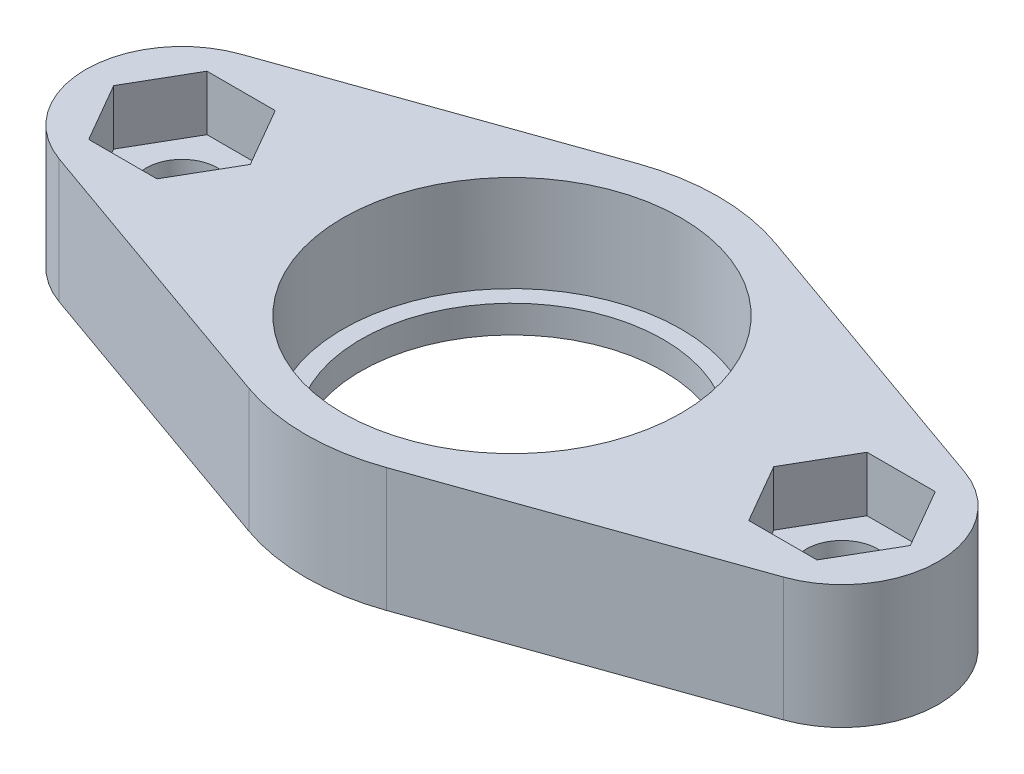
ISO-10303-21;
HEADER;
FILE_DESCRIPTION(('STEP AP214'),'2;1');
FILE_NAME('part.step','',(''),(''),'','','');
FILE_SCHEMA(('AUTOMOTIVE_DESIGN { 1 0 10303 214 1 1 1 1 }'));
ENDSEC;
DATA;
#1=APPLICATION_CONTEXT('core data for automotive mechanical design processes');
#2=APPLICATION_PROTOCOL_DEFINITION('international standard','automotive_design',2000,#1);
#3=PRODUCT_CONTEXT('',#1,'mechanical');
#4=PRODUCT('Part','Part','',(#3));
#5=PRODUCT_RELATED_PRODUCT_CATEGORY('part','',(#4));
#6=PRODUCT_DEFINITION_FORMATION('','',#4);
#7=PRODUCT_DEFINITION_CONTEXT('part definition',#1,'design');
#8=PRODUCT_DEFINITION('design','',#6,#7);
#9=PRODUCT_DEFINITION_SHAPE('','',#8);
#10=(LENGTH_UNIT() NAMED_UNIT(*) SI_UNIT(.MILLI.,.METRE.));
#11=(NAMED_UNIT(*) PLANE_ANGLE_UNIT() SI_UNIT($,.RADIAN.));
#12=(NAMED_UNIT(*) SI_UNIT($,.STERADIAN.) SOLID_ANGLE_UNIT());
#13=UNCERTAINTY_MEASURE_WITH_UNIT(LENGTH_MEASURE(1.E-05),#10,'distance_accuracy_value','');
#14=(GEOMETRIC_REPRESENTATION_CONTEXT(3) GLOBAL_UNCERTAINTY_ASSIGNED_CONTEXT((#13)) GLOBAL_UNIT_ASSIGNED_CONTEXT((#10,
#11,#12)) REPRESENTATION_CONTEXT('',''));
#15=CARTESIAN_POINT('',(0.,0.,0.));
#16=DIRECTION('',(0.,0.,1.));
#17=DIRECTION('',(1.,0.,0.));
#18=AXIS2_PLACEMENT_3D('',#15,#16,#17);
#19=CARTESIAN_POINT('',(-12.,4.5,0.));
#20=DIRECTION('',(0.,1.,0.));
#21=DIRECTION('',(0.,0.,1.));
#22=AXIS2_PLACEMENT_3D('',#19,#20,#21);
#23=CYLINDRICAL_SURFACE('',#22,1.29999999999999);
#24=CARTESIAN_POINT('',(-12.,0.,0.));
#25=DIRECTION('',(0.,1.,0.));
#26=DIRECTION('',(0.,0.,1.));
#27=AXIS2_PLACEMENT_3D('',#24,#25,#26);
#28=CIRCLE('',#27,1.3);
#29=CARTESIAN_POINT('',(-12.,0.,1.3));
#30=VERTEX_POINT('',#29);
#31=EDGE_CURVE('E282',#30,#30,#28,.T.);
#32=ORIENTED_EDGE('',*,*,#31,.F.);
#33=EDGE_LOOP('',(#32));
#34=FACE_BOUND('',#33,.T.);
#35=CARTESIAN_POINT('',(-12.,2.5,0.));
#36=DIRECTION('',(0.,1.,0.));
#37=DIRECTION('',(0.,0.,1.));
#38=AXIS2_PLACEMENT_3D('',#35,#36,#37);
#39=CIRCLE('',#38,1.29999999999999);
#40=CARTESIAN_POINT('',(-12.,2.5,1.29999999999999));
#41=VERTEX_POINT('',#40);
#42=EDGE_CURVE('E263',#41,#41,#39,.F.);
#43=ORIENTED_EDGE('',*,*,#42,.F.);
#44=EDGE_LOOP('',(#43));
#45=FACE_BOUND('',#44,.T.);
#46=ADVANCED_FACE('F32',(#34,#45),#23,.F.);
#47=CARTESIAN_POINT('',(0.,4.5,0.));
#48=DIRECTION('',(0.,-1.,0.));
#49=DIRECTION('',(0.,0.,-1.));
#50=AXIS2_PLACEMENT_3D('',#47,#48,#49);
#51=CYLINDRICAL_SURFACE('',#50,6.15);
#52=CARTESIAN_POINT('',(0.,4.5,0.));
#53=DIRECTION('',(0.,1.,0.));
#54=DIRECTION('',(0.,0.,1.));
#55=AXIS2_PLACEMENT_3D('',#52,#53,#54);
#56=CIRCLE('',#55,6.15);
#57=CARTESIAN_POINT('',(0.,4.5,6.15));
#58=VERTEX_POINT('',#57);
#59=EDGE_CURVE('E328',#58,#58,#56,.T.);
#60=ORIENTED_EDGE('',*,*,#59,.T.);
#61=EDGE_LOOP('',(#60));
#62=FACE_BOUND('',#61,.T.);
#63=CARTESIAN_POINT('',(0.,1.,0.));
#64=DIRECTION('',(0.,-1.,0.));
#65=DIRECTION('',(0.,0.,-1.));
#66=AXIS2_PLACEMENT_3D('',#63,#64,#65);
#67=CIRCLE('',#66,6.15);
#68=CARTESIAN_POINT('',(0.,1.,-6.15));
#69=VERTEX_POINT('',#68);
#70=EDGE_CURVE('E276',#69,#69,#67,.T.);
#71=ORIENTED_EDGE('',*,*,#70,.T.);
#72=EDGE_LOOP('',(#71));
#73=FACE_BOUND('',#72,.T.);
#74=ADVANCED_FACE('F351',(#62,#73),#51,.F.);
#75=CARTESIAN_POINT('',(0.,4.5,0.));
#76=DIRECTION('',(0.,-1.,0.));
#77=DIRECTION('',(0.,0.,-1.));
#78=AXIS2_PLACEMENT_3D('',#75,#76,#77);
#79=CYLINDRICAL_SURFACE('',#78,7.5);
#80=DIRECTION('',(0.,-1.,0.));
#81=VECTOR('',#80,1.);
#82=CARTESIAN_POINT('',(2.5,23.7093727122985,7.07106781186547));
#83=LINE('',#82,#81);
#84=CARTESIAN_POINT('',(2.5,4.5,7.07106781186547));
#85=VERTEX_POINT('',#84);
#86=CARTESIAN_POINT('',(2.5,0.,7.07106781186547));
#87=VERTEX_POINT('',#86);
#88=EDGE_CURVE('E293',#85,#87,#83,.T.);
#89=ORIENTED_EDGE('',*,*,#88,.F.);
#90=CARTESIAN_POINT('',(0.,4.5,0.));
#91=DIRECTION('',(0.,1.,0.));
#92=DIRECTION('',(0.,0.,1.));
#93=AXIS2_PLACEMENT_3D('',#90,#91,#92);
#94=CIRCLE('',#93,7.5);
#95=CARTESIAN_POINT('',(-2.5,4.5,7.07106781186548));
#96=VERTEX_POINT('',#95);
#97=EDGE_CURVE('E11',#96,#85,#94,.T.);
#98=ORIENTED_EDGE('',*,*,#97,.F.);
#99=DIRECTION('',(0.,-1.,0.));
#100=VECTOR('',#99,1.);
#101=CARTESIAN_POINT('',(-2.5,23.7093727122985,7.07106781186547));
#102=LINE('',#101,#100);
#103=CARTESIAN_POINT('',(-2.5,0.,7.07106781186547));
#104=VERTEX_POINT('',#103);
#105=EDGE_CURVE('E321',#96,#104,#102,.T.);
#106=ORIENTED_EDGE('',*,*,#105,.T.);
#107=CARTESIAN_POINT('',(0.,0.,0.));
#108=DIRECTION('',(0.,1.,0.));
#109=DIRECTION('',(0.,0.,1.));
#110=AXIS2_PLACEMENT_3D('',#107,#108,#109);
#111=CIRCLE('',#110,7.5);
#112=EDGE_CURVE('E343',#104,#87,#111,.T.);
#113=ORIENTED_EDGE('',*,*,#112,.T.);
#114=EDGE_LOOP('',(#89,#98,#106,#113));
#115=FACE_BOUND('',#114,.T.);
#116=ADVANCED_FACE('F357',(#115),#79,.T.);
#117=CARTESIAN_POINT('',(0.,4.5,0.));
#118=DIRECTION('',(0.,1.,0.));
#119=DIRECTION('',(0.,0.,1.));
#120=AXIS2_PLACEMENT_3D('',#117,#118,#119);
#121=PLANE('',#120);
#122=DIRECTION('',(-0.5,0.,0.866025403784438));
#123=VECTOR('',#122,1.);
#124=CARTESIAN_POINT('',(9.51739384248461,4.5,0.));
#125=LINE('',#124,#123);
#126=CARTESIAN_POINT('',(10.7586969212423,4.5,-2.15));
#127=VERTEX_POINT('',#126);
#128=CARTESIAN_POINT('',(9.51739384248461,4.5,0.));
#129=VERTEX_POINT('',#128);
#130=EDGE_CURVE('E49',#127,#129,#125,.T.);
#131=ORIENTED_EDGE('',*,*,#130,.F.);
#132=DIRECTION('',(-1.,0.,0.));
#133=VECTOR('',#132,1.);
#134=CARTESIAN_POINT('',(10.7586969212423,4.5,-2.15));
#135=LINE('',#134,#133);
#136=CARTESIAN_POINT('',(13.2413030787577,4.5,-2.15));
#137=VERTEX_POINT('',#136);
#138=EDGE_CURVE('E193',#137,#127,#135,.T.);
#139=ORIENTED_EDGE('',*,*,#138,.F.);
#140=DIRECTION('',(-0.5,0.,-0.866025403784439));
#141=VECTOR('',#140,1.);
#142=CARTESIAN_POINT('',(13.2413030787577,4.5,-2.15));
#143=LINE('',#142,#141);
#144=CARTESIAN_POINT('',(14.4826061575154,4.5,0.));
#145=VERTEX_POINT('',#144);
#146=EDGE_CURVE('E196',#145,#137,#143,.T.);
#147=ORIENTED_EDGE('',*,*,#146,.F.);
#148=DIRECTION('',(0.499999999999999,0.,-0.866025403784439));
#149=VECTOR('',#148,1.);
#150=CARTESIAN_POINT('',(14.4826061575154,4.5,0.));
#151=LINE('',#150,#149);
#152=CARTESIAN_POINT('',(13.2413030787577,4.5,2.15));
#153=VERTEX_POINT('',#152);
#154=EDGE_CURVE('E212',#153,#145,#151,.T.);
#155=ORIENTED_EDGE('',*,*,#154,.F.);
#156=DIRECTION('',(1.,0.,0.));
#157=VECTOR('',#156,1.);
#158=CARTESIAN_POINT('',(13.2413030787577,4.5,2.15));
#159=LINE('',#158,#157);
#160=CARTESIAN_POINT('',(10.7586969212423,4.5,2.15));
#161=VERTEX_POINT('',#160);
#162=EDGE_CURVE('E209',#161,#153,#159,.T.);
#163=ORIENTED_EDGE('',*,*,#162,.F.);
#164=DIRECTION('',(0.500000000000001,0.,0.866025403784438));
#165=VECTOR('',#164,1.);
#166=CARTESIAN_POINT('',(10.7586969212423,4.5,2.15));
#167=LINE('',#166,#165);
#168=EDGE_CURVE('E207',#129,#161,#167,.T.);
#169=ORIENTED_EDGE('',*,*,#168,.F.);
#170=EDGE_LOOP('',(#131,#139,#147,#155,#163,#169));
#171=FACE_BOUND('',#170,.T.);
#172=DIRECTION('',(-1.,0.,0.));
#173=VECTOR('',#172,1.);
#174=CARTESIAN_POINT('',(-10.7586969212423,4.5,-2.15));
#175=LINE('',#174,#173);
#176=CARTESIAN_POINT('',(-10.7586969212423,4.5,-2.15));
#177=VERTEX_POINT('',#176);
#178=CARTESIAN_POINT('',(-13.2413030787577,4.5,-2.15));
#179=VERTEX_POINT('',#178);
#180=EDGE_CURVE('E57',#177,#179,#175,.T.);
#181=ORIENTED_EDGE('',*,*,#180,.F.);
#182=DIRECTION('',(-0.5,0.,-0.866025403784439));
#183=VECTOR('',#182,1.);
#184=CARTESIAN_POINT('',(-9.51739384248461,4.5,0.));
#185=LINE('',#184,#183);
#186=CARTESIAN_POINT('',(-9.51739384248461,4.5,0.));
#187=VERTEX_POINT('',#186);
#188=EDGE_CURVE('E230',#187,#177,#185,.T.);
#189=ORIENTED_EDGE('',*,*,#188,.F.);
#190=DIRECTION('',(0.5,0.,-0.866025403784438));
#191=VECTOR('',#190,1.);
#192=CARTESIAN_POINT('',(-10.7586969212423,4.5,2.15));
#193=LINE('',#192,#191);
#194=CARTESIAN_POINT('',(-10.7586969212423,4.5,2.15));
#195=VERTEX_POINT('',#194);
#196=EDGE_CURVE('E256',#195,#187,#193,.T.);
#197=ORIENTED_EDGE('',*,*,#196,.F.);
#198=DIRECTION('',(1.,0.,0.));
#199=VECTOR('',#198,1.);
#200=CARTESIAN_POINT('',(-13.2413030787577,4.5,2.15));
#201=LINE('',#200,#199);
#202=CARTESIAN_POINT('',(-13.2413030787577,4.5,2.15));
#203=VERTEX_POINT('',#202);
#204=EDGE_CURVE('E253',#203,#195,#201,.T.);
#205=ORIENTED_EDGE('',*,*,#204,.F.);
#206=DIRECTION('',(0.5,0.,0.866025403784439));
#207=VECTOR('',#206,1.);
#208=CARTESIAN_POINT('',(-14.4826061575154,4.5,0.));
#209=LINE('',#208,#207);
#210=CARTESIAN_POINT('',(-14.4826061575154,4.5,0.));
#211=VERTEX_POINT('',#210);
#212=EDGE_CURVE('E250',#211,#203,#209,.T.);
#213=ORIENTED_EDGE('',*,*,#212,.F.);
#214=DIRECTION('',(-0.5,0.,0.866025403784439));
#215=VECTOR('',#214,1.);
#216=CARTESIAN_POINT('',(-13.2413030787577,4.5,-2.15));
#217=LINE('',#216,#215);
#218=EDGE_CURVE('E247',#179,#211,#217,.T.);
#219=ORIENTED_EDGE('',*,*,#218,.F.);
#220=EDGE_LOOP('',(#181,#189,#197,#205,#213,#219));
#221=FACE_BOUND('',#220,.T.);
#222=ORIENTED_EDGE('',*,*,#97,.T.);
#223=DIRECTION('',(0.942809041582064,0.,-0.333333333333333));
#224=VECTOR('',#223,1.);
#225=CARTESIAN_POINT('',(13.1666666666667,4.5,3.29983164553722));
#226=LINE('',#225,#224);
#227=CARTESIAN_POINT('',(13.1666666666667,4.5,3.29983164553722));
#228=VERTEX_POINT('',#227);
#229=EDGE_CURVE('E292',#85,#228,#226,.T.);
#230=ORIENTED_EDGE('',*,*,#229,.T.);
#231=CARTESIAN_POINT('',(12.,4.5,0.));
#232=DIRECTION('',(0.,1.,0.));
#233=DIRECTION('',(0.,0.,1.));
#234=AXIS2_PLACEMENT_3D('',#231,#232,#233);
#235=CIRCLE('',#234,3.5);
#236=CARTESIAN_POINT('',(13.1666666666667,4.5,-3.29983164553722));
#237=VERTEX_POINT('',#236);
#238=EDGE_CURVE('E304',#228,#237,#235,.T.);
#239=ORIENTED_EDGE('',*,*,#238,.T.);
#240=DIRECTION('',(-0.942809041582064,0.,-0.333333333333333));
#241=VECTOR('',#240,1.);
#242=CARTESIAN_POINT('',(13.1666666666667,4.5,-3.29983164553722));
#243=LINE('',#242,#241);
#244=CARTESIAN_POINT('',(2.5,4.5,-7.07106781186548));
#245=VERTEX_POINT('',#244);
#246=EDGE_CURVE('E301',#237,#245,#243,.T.);
#247=ORIENTED_EDGE('',*,*,#246,.T.);
#248=CARTESIAN_POINT('',(-2.5,4.5,-7.07106781186547));
#249=VERTEX_POINT('',#248);
#250=EDGE_CURVE('E41',#245,#249,#94,.T.);
#251=ORIENTED_EDGE('',*,*,#250,.T.);
#252=DIRECTION('',(-0.942809041582064,0.,0.333333333333333));
#253=VECTOR('',#252,1.);
#254=CARTESIAN_POINT('',(-13.1666666666667,4.5,-3.29983164553722));
#255=LINE('',#254,#253);
#256=CARTESIAN_POINT('',(-13.1666666666667,4.5,-3.29983164553722));
#257=VERTEX_POINT('',#256);
#258=EDGE_CURVE('E317',#249,#257,#255,.T.);
#259=ORIENTED_EDGE('',*,*,#258,.T.);
#260=CARTESIAN_POINT('',(-12.,4.5,0.));
#261=DIRECTION('',(0.,1.,0.));
#262=DIRECTION('',(0.,0.,1.));
#263=AXIS2_PLACEMENT_3D('',#260,#261,#262);
#264=CIRCLE('',#263,3.5);
#265=CARTESIAN_POINT('',(-13.1666666666667,4.5,3.29983164553722));
#266=VERTEX_POINT('',#265);
#267=EDGE_CURVE('E329',#257,#266,#264,.T.);
#268=ORIENTED_EDGE('',*,*,#267,.T.);
#269=DIRECTION('',(0.942809041582064,0.,0.333333333333333));
#270=VECTOR('',#269,1.);
#271=CARTESIAN_POINT('',(-13.1666666666667,4.5,3.29983164553722));
#272=LINE('',#271,#270);
#273=EDGE_CURVE('E326',#266,#96,#272,.T.);
#274=ORIENTED_EDGE('',*,*,#273,.T.);
#275=EDGE_LOOP('',(#222,#230,#239,#247,#251,#259,#268,#274));
#276=FACE_BOUND('',#275,.T.);
#277=ORIENTED_EDGE('',*,*,#59,.F.);
#278=EDGE_LOOP('',(#277));
#279=FACE_BOUND('',#278,.T.);
#280=ADVANCED_FACE('F393',(#171,#221,#276,#279),#121,.T.);
#281=CARTESIAN_POINT('',(0.,0.,0.));
#282=DIRECTION('',(0.,1.,0.));
#283=DIRECTION('',(0.,0.,1.));
#284=AXIS2_PLACEMENT_3D('',#281,#282,#283);
#285=PLANE('',#284);
#286=ORIENTED_EDGE('',*,*,#31,.T.);
#287=EDGE_LOOP('',(#286));
#288=FACE_BOUND('',#287,.T.);
#289=CARTESIAN_POINT('',(12.,0.,0.));
#290=DIRECTION('',(0.,1.,0.));
#291=DIRECTION('',(0.,0.,1.));
#292=AXIS2_PLACEMENT_3D('',#289,#290,#291);
#293=CIRCLE('',#292,1.3);
#294=CARTESIAN_POINT('',(12.,0.,1.3));
#295=VERTEX_POINT('',#294);
#296=EDGE_CURVE('E285',#295,#295,#293,.T.);
#297=ORIENTED_EDGE('',*,*,#296,.T.);
#298=EDGE_LOOP('',(#297));
#299=FACE_BOUND('',#298,.T.);
#300=ORIENTED_EDGE('',*,*,#112,.F.);
#301=DIRECTION('',(0.942809041582063,0.,0.333333333333333));
#302=VECTOR('',#301,1.);
#303=CARTESIAN_POINT('',(-13.1666666666667,0.,3.29983164553722));
#304=LINE('',#303,#302);
#305=CARTESIAN_POINT('',(-13.1666666666667,0.,3.29983164553722));
#306=VERTEX_POINT('',#305);
#307=EDGE_CURVE('E319',#306,#104,#304,.T.);
#308=ORIENTED_EDGE('',*,*,#307,.F.);
#309=CARTESIAN_POINT('',(-12.,0.,0.));
#310=DIRECTION('',(0.,1.,0.));
#311=DIRECTION('',(0.,0.,1.));
#312=AXIS2_PLACEMENT_3D('',#309,#310,#311);
#313=CIRCLE('',#312,3.5);
#314=CARTESIAN_POINT('',(-13.1666666666667,0.,-3.29983164553722));
#315=VERTEX_POINT('',#314);
#316=EDGE_CURVE('E323',#315,#306,#313,.T.);
#317=ORIENTED_EDGE('',*,*,#316,.F.);
#318=DIRECTION('',(-0.942809041582063,0.,0.333333333333333));
#319=VECTOR('',#318,1.);
#320=CARTESIAN_POINT('',(-13.1666666666667,0.,-3.29983164553722));
#321=LINE('',#320,#319);
#322=CARTESIAN_POINT('',(-2.5,0.,-7.07106781186547));
#323=VERTEX_POINT('',#322);
#324=EDGE_CURVE('E314',#323,#315,#321,.T.);
#325=ORIENTED_EDGE('',*,*,#324,.F.);
#326=CARTESIAN_POINT('',(2.5,0.,-7.07106781186547));
#327=VERTEX_POINT('',#326);
#328=EDGE_CURVE('E341',#327,#323,#111,.T.);
#329=ORIENTED_EDGE('',*,*,#328,.F.);
#330=DIRECTION('',(-0.942809041582063,0.,-0.333333333333333));
#331=VECTOR('',#330,1.);
#332=CARTESIAN_POINT('',(13.1666666666667,0.,-3.29983164553722));
#333=LINE('',#332,#331);
#334=CARTESIAN_POINT('',(13.1666666666667,0.,-3.29983164553722));
#335=VERTEX_POINT('',#334);
#336=EDGE_CURVE('E294',#335,#327,#333,.T.);
#337=ORIENTED_EDGE('',*,*,#336,.F.);
#338=CARTESIAN_POINT('',(12.,0.,0.));
#339=DIRECTION('',(0.,1.,0.));
#340=DIRECTION('',(0.,0.,-1.));
#341=AXIS2_PLACEMENT_3D('',#338,#339,#340);
#342=CIRCLE('',#341,3.5);
#343=CARTESIAN_POINT('',(13.1666666666667,0.,3.29983164553722));
#344=VERTEX_POINT('',#343);
#345=EDGE_CURVE('E298',#344,#335,#342,.T.);
#346=ORIENTED_EDGE('',*,*,#345,.F.);
#347=DIRECTION('',(0.942809041582063,0.,-0.333333333333333));
#348=VECTOR('',#347,1.);
#349=CARTESIAN_POINT('',(13.1666666666667,0.,3.29983164553722));
#350=LINE('',#349,#348);
#351=EDGE_CURVE('E289',#87,#344,#350,.T.);
#352=ORIENTED_EDGE('',*,*,#351,.F.);
#353=EDGE_LOOP('',(#300,#308,#317,#325,#329,#337,#346,#352));
#354=FACE_BOUND('',#353,.T.);
#355=CARTESIAN_POINT('',(0.,0.,0.));
#356=DIRECTION('',(0.,-1.,0.));
#357=DIRECTION('',(0.,0.,-1.));
#358=AXIS2_PLACEMENT_3D('',#355,#356,#357);
#359=CIRCLE('',#358,5.5);
#360=CARTESIAN_POINT('',(0.,0.,-5.5));
#361=VERTEX_POINT('',#360);
#362=EDGE_CURVE('E277',#361,#361,#359,.T.);
#363=ORIENTED_EDGE('',*,*,#362,.F.);
#364=EDGE_LOOP('',(#363));
#365=FACE_BOUND('',#364,.T.);
#366=ADVANCED_FACE('F395',(#288,#299,#354,#365),#285,.F.);
#367=ORIENTED_EDGE('',*,*,#250,.F.);
#368=DIRECTION('',(0.,-1.,0.));
#369=VECTOR('',#368,1.);
#370=CARTESIAN_POINT('',(2.5,23.7093727122985,-7.07106781186547));
#371=LINE('',#370,#369);
#372=EDGE_CURVE('E296',#245,#327,#371,.T.);
#373=ORIENTED_EDGE('',*,*,#372,.T.);
#374=ORIENTED_EDGE('',*,*,#328,.T.);
#375=DIRECTION('',(0.,-1.,0.));
#376=VECTOR('',#375,1.);
#377=CARTESIAN_POINT('',(-2.5,23.7093727122985,-7.07106781186547));
#378=LINE('',#377,#376);
#379=EDGE_CURVE('E318',#249,#323,#378,.T.);
#380=ORIENTED_EDGE('',*,*,#379,.F.);
#381=EDGE_LOOP('',(#367,#373,#374,#380));
#382=FACE_BOUND('',#381,.T.);
#383=ADVANCED_FACE('F34',(#382),#79,.T.);
#384=CARTESIAN_POINT('',(-12.,23.7093727122985,0.));
#385=DIRECTION('',(0.,-1.,0.));
#386=DIRECTION('',(0.,0.,-1.));
#387=AXIS2_PLACEMENT_3D('',#384,#385,#386);
#388=CYLINDRICAL_SURFACE('',#387,3.5);
#389=ORIENTED_EDGE('',*,*,#267,.F.);
#390=DIRECTION('',(0.,-1.,0.));
#391=VECTOR('',#390,1.);
#392=CARTESIAN_POINT('',(-13.1666666666667,23.7093727122985,-3.29983164553722));
#393=LINE('',#392,#391);
#394=EDGE_CURVE('E303',#257,#315,#393,.T.);
#395=ORIENTED_EDGE('',*,*,#394,.T.);
#396=ORIENTED_EDGE('',*,*,#316,.T.);
#397=DIRECTION('',(0.,-1.,0.));
#398=VECTOR('',#397,1.);
#399=CARTESIAN_POINT('',(-13.1666666666667,23.7093727122985,3.29983164553722));
#400=LINE('',#399,#398);
#401=EDGE_CURVE('E322',#266,#306,#400,.T.);
#402=ORIENTED_EDGE('',*,*,#401,.F.);
#403=EDGE_LOOP('',(#389,#395,#396,#402));
#404=FACE_BOUND('',#403,.T.);
#405=ADVANCED_FACE('F388',(#404),#388,.T.);
#406=CARTESIAN_POINT('',(-13.1666666666667,23.7093727122985,3.29983164553722));
#407=DIRECTION('',(0.333333333333333,0.,-0.942809041582063));
#408=DIRECTION('',(-0.942809041582064,0.,-0.333333333333333));
#409=AXIS2_PLACEMENT_3D('',#406,#407,#408);
#410=PLANE('',#409);
#411=ORIENTED_EDGE('',*,*,#273,.F.);
#412=ORIENTED_EDGE('',*,*,#401,.T.);
#413=ORIENTED_EDGE('',*,*,#307,.T.);
#414=ORIENTED_EDGE('',*,*,#105,.F.);
#415=EDGE_LOOP('',(#411,#412,#413,#414));
#416=FACE_BOUND('',#415,.T.);
#417=ADVANCED_FACE('F384',(#416),#410,.F.);
#418=CARTESIAN_POINT('',(-13.1666666666667,23.7093727122985,-3.29983164553722));
#419=DIRECTION('',(0.333333333333333,0.,0.942809041582063));
#420=DIRECTION('',(0.942809041582064,0.,-0.333333333333333));
#421=AXIS2_PLACEMENT_3D('',#418,#419,#420);
#422=PLANE('',#421);
#423=ORIENTED_EDGE('',*,*,#258,.F.);
#424=ORIENTED_EDGE('',*,*,#379,.T.);
#425=ORIENTED_EDGE('',*,*,#324,.T.);
#426=ORIENTED_EDGE('',*,*,#394,.F.);
#427=EDGE_LOOP('',(#423,#424,#425,#426));
#428=FACE_BOUND('',#427,.T.);
#429=ADVANCED_FACE('F380',(#428),#422,.F.);
#430=CARTESIAN_POINT('',(12.,23.7093727122985,0.));
#431=DIRECTION('',(0.,-1.,0.));
#432=DIRECTION('',(0.,0.,-1.));
#433=AXIS2_PLACEMENT_3D('',#430,#431,#432);
#434=CYLINDRICAL_SURFACE('',#433,3.5);
#435=ORIENTED_EDGE('',*,*,#238,.F.);
#436=DIRECTION('',(0.,-1.,0.));
#437=VECTOR('',#436,1.);
#438=CARTESIAN_POINT('',(13.1666666666667,23.7093727122985,3.29983164553722));
#439=LINE('',#438,#437);
#440=EDGE_CURVE('E288',#228,#344,#439,.T.);
#441=ORIENTED_EDGE('',*,*,#440,.T.);
#442=ORIENTED_EDGE('',*,*,#345,.T.);
#443=DIRECTION('',(0.,-1.,0.));
#444=VECTOR('',#443,1.);
#445=CARTESIAN_POINT('',(13.1666666666667,23.7093727122985,-3.29983164553722));
#446=LINE('',#445,#444);
#447=EDGE_CURVE('E297',#237,#335,#446,.T.);
#448=ORIENTED_EDGE('',*,*,#447,.F.);
#449=EDGE_LOOP('',(#435,#441,#442,#448));
#450=FACE_BOUND('',#449,.T.);
#451=ADVANCED_FACE('F376',(#450),#434,.T.);
#452=CARTESIAN_POINT('',(13.1666666666667,23.7093727122985,-3.29983164553722));
#453=DIRECTION('',(-0.333333333333333,0.,0.942809041582063));
#454=DIRECTION('',(0.942809041582064,0.,0.333333333333333));
#455=AXIS2_PLACEMENT_3D('',#452,#453,#454);
#456=PLANE('',#455);
#457=ORIENTED_EDGE('',*,*,#246,.F.);
#458=ORIENTED_EDGE('',*,*,#447,.T.);
#459=ORIENTED_EDGE('',*,*,#336,.T.);
#460=ORIENTED_EDGE('',*,*,#372,.F.);
#461=EDGE_LOOP('',(#457,#458,#459,#460));
#462=FACE_BOUND('',#461,.T.);
#463=ADVANCED_FACE('F372',(#462),#456,.F.);
#464=CARTESIAN_POINT('',(13.1666666666667,23.7093727122985,3.29983164553722));
#465=DIRECTION('',(-0.333333333333333,0.,-0.942809041582063));
#466=DIRECTION('',(-0.942809041582064,0.,0.333333333333333));
#467=AXIS2_PLACEMENT_3D('',#464,#465,#466);
#468=PLANE('',#467);
#469=ORIENTED_EDGE('',*,*,#229,.F.);
#470=ORIENTED_EDGE('',*,*,#88,.T.);
#471=ORIENTED_EDGE('',*,*,#351,.T.);
#472=ORIENTED_EDGE('',*,*,#440,.F.);
#473=EDGE_LOOP('',(#469,#470,#471,#472));
#474=FACE_BOUND('',#473,.T.);
#475=ADVANCED_FACE('F368',(#474),#468,.F.);
#476=CARTESIAN_POINT('',(12.,4.5,0.));
#477=DIRECTION('',(0.,1.,0.));
#478=DIRECTION('',(0.,0.,1.));
#479=AXIS2_PLACEMENT_3D('',#476,#477,#478);
#480=CYLINDRICAL_SURFACE('',#479,1.29999999999999);
#481=CARTESIAN_POINT('',(12.,2.5,0.));
#482=DIRECTION('',(0.,-1.,0.));
#483=DIRECTION('',(0.,0.,-1.));
#484=AXIS2_PLACEMENT_3D('',#481,#482,#483);
#485=CIRCLE('',#484,1.29999999999999);
#486=CARTESIAN_POINT('',(12.,2.5,-1.29999999999999));
#487=VERTEX_POINT('',#486);
#488=EDGE_CURVE('E36',#487,#487,#485,.F.);
#489=ORIENTED_EDGE('',*,*,#488,.T.);
#490=EDGE_LOOP('',(#489));
#491=FACE_BOUND('',#490,.T.);
#492=ORIENTED_EDGE('',*,*,#296,.F.);
#493=EDGE_LOOP('',(#492));
#494=FACE_BOUND('',#493,.T.);
#495=ADVANCED_FACE('F365',(#491,#494),#480,.F.);
#496=CARTESIAN_POINT('',(0.,1.,0.));
#497=DIRECTION('',(0.,-1.,0.));
#498=DIRECTION('',(0.,0.,-1.));
#499=AXIS2_PLACEMENT_3D('',#496,#497,#498);
#500=PLANE('',#499);
#501=CARTESIAN_POINT('',(0.,1.,0.));
#502=DIRECTION('',(0.,-1.,0.));
#503=DIRECTION('',(0.,0.,-1.));
#504=AXIS2_PLACEMENT_3D('',#501,#502,#503);
#505=CIRCLE('',#504,5.5);
#506=CARTESIAN_POINT('',(0.,1.,-5.5));
#507=VERTEX_POINT('',#506);
#508=EDGE_CURVE('E273',#507,#507,#505,.T.);
#509=ORIENTED_EDGE('',*,*,#508,.T.);
#510=EDGE_LOOP('',(#509));
#511=FACE_BOUND('',#510,.T.);
#512=ORIENTED_EDGE('',*,*,#70,.F.);
#513=EDGE_LOOP('',(#512));
#514=FACE_BOUND('',#513,.T.);
#515=ADVANCED_FACE('F363',(#511,#514),#500,.F.);
#516=CARTESIAN_POINT('',(0.,1.,0.));
#517=DIRECTION('',(0.,-1.,0.));
#518=DIRECTION('',(0.,0.,-1.));
#519=AXIS2_PLACEMENT_3D('',#516,#517,#518);
#520=CYLINDRICAL_SURFACE('',#519,5.5);
#521=ORIENTED_EDGE('',*,*,#508,.F.);
#522=EDGE_LOOP('',(#521));
#523=FACE_BOUND('',#522,.T.);
#524=ORIENTED_EDGE('',*,*,#362,.T.);
#525=EDGE_LOOP('',(#524));
#526=FACE_BOUND('',#525,.T.);
#527=ADVANCED_FACE('F412',(#523,#526),#520,.F.);
#528=CARTESIAN_POINT('',(0.,2.5,0.));
#529=DIRECTION('',(0.,1.,0.));
#530=DIRECTION('',(0.,0.,1.));
#531=AXIS2_PLACEMENT_3D('',#528,#529,#530);
#532=PLANE('',#531);
#533=DIRECTION('',(-1.,0.,0.));
#534=VECTOR('',#533,1.);
#535=CARTESIAN_POINT('',(-10.7586969212423,2.5,-2.15));
#536=LINE('',#535,#534);
#537=CARTESIAN_POINT('',(-10.7586969212423,2.5,-2.15));
#538=VERTEX_POINT('',#537);
#539=CARTESIAN_POINT('',(-13.2413030787577,2.5,-2.15));
#540=VERTEX_POINT('',#539);
#541=EDGE_CURVE('E226',#538,#540,#536,.T.);
#542=ORIENTED_EDGE('',*,*,#541,.T.);
#543=DIRECTION('',(-0.5,0.,0.866025403784439));
#544=VECTOR('',#543,1.);
#545=CARTESIAN_POINT('',(-13.2413030787577,2.5,-2.15));
#546=LINE('',#545,#544);
#547=CARTESIAN_POINT('',(-14.4826061575154,2.5,0.));
#548=VERTEX_POINT('',#547);
#549=EDGE_CURVE('E229',#540,#548,#546,.T.);
#550=ORIENTED_EDGE('',*,*,#549,.T.);
#551=DIRECTION('',(0.5,0.,0.866025403784439));
#552=VECTOR('',#551,1.);
#553=CARTESIAN_POINT('',(-14.4826061575154,2.5,0.));
#554=LINE('',#553,#552);
#555=CARTESIAN_POINT('',(-13.2413030787577,2.5,2.15));
#556=VERTEX_POINT('',#555);
#557=EDGE_CURVE('E233',#548,#556,#554,.T.);
#558=ORIENTED_EDGE('',*,*,#557,.T.);
#559=DIRECTION('',(1.,0.,0.));
#560=VECTOR('',#559,1.);
#561=CARTESIAN_POINT('',(-13.2413030787577,2.5,2.15));
#562=LINE('',#561,#560);
#563=CARTESIAN_POINT('',(-10.7586969212423,2.5,2.15));
#564=VERTEX_POINT('',#563);
#565=EDGE_CURVE('E236',#556,#564,#562,.T.);
#566=ORIENTED_EDGE('',*,*,#565,.T.);
#567=DIRECTION('',(0.5,0.,-0.866025403784438));
#568=VECTOR('',#567,1.);
#569=CARTESIAN_POINT('',(-10.7586969212423,2.5,2.15));
#570=LINE('',#569,#568);
#571=CARTESIAN_POINT('',(-9.51739384248461,2.5,0.));
#572=VERTEX_POINT('',#571);
#573=EDGE_CURVE('E239',#564,#572,#570,.T.);
#574=ORIENTED_EDGE('',*,*,#573,.T.);
#575=DIRECTION('',(-0.5,0.,-0.866025403784439));
#576=VECTOR('',#575,1.);
#577=CARTESIAN_POINT('',(-9.51739384248461,2.5,0.));
#578=LINE('',#577,#576);
#579=EDGE_CURVE('E242',#572,#538,#578,.T.);
#580=ORIENTED_EDGE('',*,*,#579,.T.);
#581=EDGE_LOOP('',(#542,#550,#558,#566,#574,#580));
#582=FACE_BOUND('',#581,.T.);
#583=ORIENTED_EDGE('',*,*,#42,.T.);
#584=EDGE_LOOP('',(#583));
#585=FACE_BOUND('',#584,.T.);
#586=ADVANCED_FACE('F348',(#582,#585),#532,.T.);
#587=CARTESIAN_POINT('',(-10.7586969212423,2.5,-2.15));
#588=DIRECTION('',(0.,0.,-1.));
#589=DIRECTION('',(-1.,0.,0.));
#590=AXIS2_PLACEMENT_3D('',#587,#588,#589);
#591=PLANE('',#590);
#592=ORIENTED_EDGE('',*,*,#180,.T.);
#593=DIRECTION('',(0.,1.,0.));
#594=VECTOR('',#593,1.);
#595=CARTESIAN_POINT('',(-13.2413030787577,2.5,-2.15));
#596=LINE('',#595,#594);
#597=EDGE_CURVE('E245',#540,#179,#596,.T.);
#598=ORIENTED_EDGE('',*,*,#597,.F.);
#599=ORIENTED_EDGE('',*,*,#541,.F.);
#600=DIRECTION('',(0.,1.,0.));
#601=VECTOR('',#600,1.);
#602=CARTESIAN_POINT('',(-10.7586969212423,2.5,-2.15));
#603=LINE('',#602,#601);
#604=EDGE_CURVE('E261',#538,#177,#603,.T.);
#605=ORIENTED_EDGE('',*,*,#604,.T.);
#606=EDGE_LOOP('',(#592,#598,#599,#605));
#607=FACE_BOUND('',#606,.T.);
#608=ADVANCED_FACE('F419',(#607),#591,.F.);
#609=CARTESIAN_POINT('',(-9.51739384248461,2.5,0.));
#610=DIRECTION('',(0.866025403784439,0.,-0.5));
#611=DIRECTION('',(-0.5,0.,-0.866025403784439));
#612=AXIS2_PLACEMENT_3D('',#609,#610,#611);
#613=PLANE('',#612);
#614=ORIENTED_EDGE('',*,*,#188,.T.);
#615=ORIENTED_EDGE('',*,*,#604,.F.);
#616=ORIENTED_EDGE('',*,*,#579,.F.);
#617=DIRECTION('',(0.,1.,0.));
#618=VECTOR('',#617,1.);
#619=CARTESIAN_POINT('',(-9.51739384248461,2.5,0.));
#620=LINE('',#619,#618);
#621=EDGE_CURVE('E264',#572,#187,#620,.T.);
#622=ORIENTED_EDGE('',*,*,#621,.T.);
#623=EDGE_LOOP('',(#614,#615,#616,#622));
#624=FACE_BOUND('',#623,.T.);
#625=ADVANCED_FACE('F427',(#624),#613,.F.);
#626=CARTESIAN_POINT('',(-10.7586969212423,2.5,2.15));
#627=DIRECTION('',(0.866025403784439,0.,0.5));
#628=DIRECTION('',(0.5,0.,-0.866025403784439));
#629=AXIS2_PLACEMENT_3D('',#626,#627,#628);
#630=PLANE('',#629);
#631=ORIENTED_EDGE('',*,*,#196,.T.);
#632=ORIENTED_EDGE('',*,*,#621,.F.);
#633=ORIENTED_EDGE('',*,*,#573,.F.);
#634=DIRECTION('',(0.,1.,0.));
#635=VECTOR('',#634,1.);
#636=CARTESIAN_POINT('',(-10.7586969212423,2.5,2.15));
#637=LINE('',#636,#635);
#638=EDGE_CURVE('E266',#564,#195,#637,.T.);
#639=ORIENTED_EDGE('',*,*,#638,.T.);
#640=EDGE_LOOP('',(#631,#632,#633,#639));
#641=FACE_BOUND('',#640,.T.);
#642=ADVANCED_FACE('F439',(#641),#630,.F.);
#643=CARTESIAN_POINT('',(-13.2413030787577,2.5,2.15));
#644=DIRECTION('',(0.,0.,1.));
#645=DIRECTION('',(1.,0.,0.));
#646=AXIS2_PLACEMENT_3D('',#643,#644,#645);
#647=PLANE('',#646);
#648=ORIENTED_EDGE('',*,*,#204,.T.);
#649=ORIENTED_EDGE('',*,*,#638,.F.);
#650=ORIENTED_EDGE('',*,*,#565,.F.);
#651=DIRECTION('',(0.,1.,0.));
#652=VECTOR('',#651,1.);
#653=CARTESIAN_POINT('',(-13.2413030787577,2.5,2.15));
#654=LINE('',#653,#652);
#655=EDGE_CURVE('E268',#556,#203,#654,.T.);
#656=ORIENTED_EDGE('',*,*,#655,.T.);
#657=EDGE_LOOP('',(#648,#649,#650,#656));
#658=FACE_BOUND('',#657,.T.);
#659=ADVANCED_FACE('F435',(#658),#647,.F.);
#660=CARTESIAN_POINT('',(-14.4826061575154,2.5,0.));
#661=DIRECTION('',(-0.866025403784439,0.,0.5));
#662=DIRECTION('',(0.5,0.,0.866025403784439));
#663=AXIS2_PLACEMENT_3D('',#660,#661,#662);
#664=PLANE('',#663);
#665=ORIENTED_EDGE('',*,*,#212,.T.);
#666=ORIENTED_EDGE('',*,*,#655,.F.);
#667=ORIENTED_EDGE('',*,*,#557,.F.);
#668=DIRECTION('',(0.,1.,0.));
#669=VECTOR('',#668,1.);
#670=CARTESIAN_POINT('',(-14.4826061575154,2.5,0.));
#671=LINE('',#670,#669);
#672=EDGE_CURVE('E270',#548,#211,#671,.T.);
#673=ORIENTED_EDGE('',*,*,#672,.T.);
#674=EDGE_LOOP('',(#665,#666,#667,#673));
#675=FACE_BOUND('',#674,.T.);
#676=ADVANCED_FACE('F431',(#675),#664,.F.);
#677=CARTESIAN_POINT('',(-13.2413030787577,2.5,-2.15));
#678=DIRECTION('',(-0.866025403784439,0.,-0.499999999999999));
#679=DIRECTION('',(-0.5,0.,0.866025403784439));
#680=AXIS2_PLACEMENT_3D('',#677,#678,#679);
#681=PLANE('',#680);
#682=ORIENTED_EDGE('',*,*,#218,.T.);
#683=ORIENTED_EDGE('',*,*,#672,.F.);
#684=ORIENTED_EDGE('',*,*,#549,.F.);
#685=ORIENTED_EDGE('',*,*,#597,.T.);
#686=EDGE_LOOP('',(#682,#683,#684,#685));
#687=FACE_BOUND('',#686,.T.);
#688=ADVANCED_FACE('F428',(#687),#681,.F.);
#689=CARTESIAN_POINT('',(0.,2.5,0.));
#690=DIRECTION('',(0.,-1.,0.));
#691=DIRECTION('',(0.,0.,-1.));
#692=AXIS2_PLACEMENT_3D('',#689,#690,#691);
#693=PLANE('',#692);
#694=DIRECTION('',(-0.5,0.,0.866025403784438));
#695=VECTOR('',#694,1.);
#696=CARTESIAN_POINT('',(9.51739384248461,2.5,0.));
#697=LINE('',#696,#695);
#698=CARTESIAN_POINT('',(10.7586969212423,2.5,-2.15));
#699=VERTEX_POINT('',#698);
#700=CARTESIAN_POINT('',(9.51739384248461,2.5,0.));
#701=VERTEX_POINT('',#700);
#702=EDGE_CURVE('E173',#699,#701,#697,.T.);
#703=ORIENTED_EDGE('',*,*,#702,.T.);
#704=DIRECTION('',(0.500000000000001,0.,0.866025403784438));
#705=VECTOR('',#704,1.);
#706=CARTESIAN_POINT('',(10.7586969212423,2.5,2.15));
#707=LINE('',#706,#705);
#708=CARTESIAN_POINT('',(10.7586969212423,2.5,2.15));
#709=VERTEX_POINT('',#708);
#710=EDGE_CURVE('E182',#701,#709,#707,.T.);
#711=ORIENTED_EDGE('',*,*,#710,.T.);
#712=DIRECTION('',(1.,0.,0.));
#713=VECTOR('',#712,1.);
#714=CARTESIAN_POINT('',(13.2413030787577,2.5,2.15));
#715=LINE('',#714,#713);
#716=CARTESIAN_POINT('',(13.2413030787577,2.5,2.15));
#717=VERTEX_POINT('',#716);
#718=EDGE_CURVE('E187',#709,#717,#715,.T.);
#719=ORIENTED_EDGE('',*,*,#718,.T.);
#720=DIRECTION('',(0.499999999999999,0.,-0.866025403784439));
#721=VECTOR('',#720,1.);
#722=CARTESIAN_POINT('',(14.4826061575154,2.5,0.));
#723=LINE('',#722,#721);
#724=CARTESIAN_POINT('',(14.4826061575154,2.5,0.));
#725=VERTEX_POINT('',#724);
#726=EDGE_CURVE('E200',#717,#725,#723,.T.);
#727=ORIENTED_EDGE('',*,*,#726,.T.);
#728=DIRECTION('',(-0.5,0.,-0.866025403784439));
#729=VECTOR('',#728,1.);
#730=CARTESIAN_POINT('',(13.2413030787577,2.5,-2.15));
#731=LINE('',#730,#729);
#732=CARTESIAN_POINT('',(13.2413030787577,2.5,-2.15));
#733=VERTEX_POINT('',#732);
#734=EDGE_CURVE('E203',#725,#733,#731,.T.);
#735=ORIENTED_EDGE('',*,*,#734,.T.);
#736=DIRECTION('',(-1.,0.,0.));
#737=VECTOR('',#736,1.);
#738=CARTESIAN_POINT('',(10.7586969212423,2.5,-2.15));
#739=LINE('',#738,#737);
#740=EDGE_CURVE('E179',#733,#699,#739,.T.);
#741=ORIENTED_EDGE('',*,*,#740,.T.);
#742=EDGE_LOOP('',(#703,#711,#719,#727,#735,#741));
#743=FACE_BOUND('',#742,.T.);
#744=ORIENTED_EDGE('',*,*,#488,.F.);
#745=EDGE_LOOP('',(#744));
#746=FACE_BOUND('',#745,.T.);
#747=ADVANCED_FACE('F189',(#743,#746),#693,.F.);
#748=CARTESIAN_POINT('',(9.51739384248461,2.5,0.));
#749=DIRECTION('',(-0.866025403784438,0.,-0.5));
#750=DIRECTION('',(-0.5,0.,0.866025403784439));
#751=AXIS2_PLACEMENT_3D('',#748,#749,#750);
#752=PLANE('',#751);
#753=ORIENTED_EDGE('',*,*,#130,.T.);
#754=DIRECTION('',(0.,1.,0.));
#755=VECTOR('',#754,1.);
#756=CARTESIAN_POINT('',(9.51739384248461,2.5,0.));
#757=LINE('',#756,#755);
#758=EDGE_CURVE('E169',#701,#129,#757,.T.);
#759=ORIENTED_EDGE('',*,*,#758,.F.);
#760=ORIENTED_EDGE('',*,*,#702,.F.);
#761=DIRECTION('',(0.,1.,0.));
#762=VECTOR('',#761,1.);
#763=CARTESIAN_POINT('',(10.7586969212423,2.5,-2.15));
#764=LINE('',#763,#762);
#765=EDGE_CURVE('E217',#699,#127,#764,.T.);
#766=ORIENTED_EDGE('',*,*,#765,.T.);
#767=EDGE_LOOP('',(#753,#759,#760,#766));
#768=FACE_BOUND('',#767,.T.);
#769=ADVANCED_FACE('F171',(#768),#752,.F.);
#770=CARTESIAN_POINT('',(10.7586969212423,2.5,-2.15));
#771=DIRECTION('',(0.,0.,-1.));
#772=DIRECTION('',(-1.,0.,0.));
#773=AXIS2_PLACEMENT_3D('',#770,#771,#772);
#774=PLANE('',#773);
#775=ORIENTED_EDGE('',*,*,#138,.T.);
#776=ORIENTED_EDGE('',*,*,#765,.F.);
#777=ORIENTED_EDGE('',*,*,#740,.F.);
#778=DIRECTION('',(0.,1.,0.));
#779=VECTOR('',#778,1.);
#780=CARTESIAN_POINT('',(13.2413030787577,2.5,-2.15));
#781=LINE('',#780,#779);
#782=EDGE_CURVE('E219',#733,#137,#781,.T.);
#783=ORIENTED_EDGE('',*,*,#782,.T.);
#784=EDGE_LOOP('',(#775,#776,#777,#783));
#785=FACE_BOUND('',#784,.T.);
#786=ADVANCED_FACE('F449',(#785),#774,.F.);
#787=CARTESIAN_POINT('',(13.2413030787577,2.5,-2.15));
#788=DIRECTION('',(0.866025403784439,0.,-0.5));
#789=DIRECTION('',(-0.5,0.,-0.866025403784439));
#790=AXIS2_PLACEMENT_3D('',#787,#788,#789);
#791=PLANE('',#790);
#792=ORIENTED_EDGE('',*,*,#146,.T.);
#793=ORIENTED_EDGE('',*,*,#782,.F.);
#794=ORIENTED_EDGE('',*,*,#734,.F.);
#795=DIRECTION('',(0.,1.,0.));
#796=VECTOR('',#795,1.);
#797=CARTESIAN_POINT('',(14.4826061575154,2.5,0.));
#798=LINE('',#797,#796);
#799=EDGE_CURVE('E221',#725,#145,#798,.T.);
#800=ORIENTED_EDGE('',*,*,#799,.T.);
#801=EDGE_LOOP('',(#792,#793,#794,#800));
#802=FACE_BOUND('',#801,.T.);
#803=ADVANCED_FACE('F459',(#802),#791,.F.);
#804=CARTESIAN_POINT('',(14.4826061575154,2.5,0.));
#805=DIRECTION('',(0.866025403784439,0.,0.499999999999999));
#806=DIRECTION('',(0.499999999999999,0.,-0.866025403784439));
#807=AXIS2_PLACEMENT_3D('',#804,#805,#806);
#808=PLANE('',#807);
#809=ORIENTED_EDGE('',*,*,#154,.T.);
#810=ORIENTED_EDGE('',*,*,#799,.F.);
#811=ORIENTED_EDGE('',*,*,#726,.F.);
#812=DIRECTION('',(0.,1.,0.));
#813=VECTOR('',#812,1.);
#814=CARTESIAN_POINT('',(13.2413030787577,2.5,2.15));
#815=LINE('',#814,#813);
#816=EDGE_CURVE('E223',#717,#153,#815,.T.);
#817=ORIENTED_EDGE('',*,*,#816,.T.);
#818=EDGE_LOOP('',(#809,#810,#811,#817));
#819=FACE_BOUND('',#818,.T.);
#820=ADVANCED_FACE('F455',(#819),#808,.F.);
#821=CARTESIAN_POINT('',(13.2413030787577,2.5,2.15));
#822=DIRECTION('',(0.,0.,1.));
#823=DIRECTION('',(1.,0.,0.));
#824=AXIS2_PLACEMENT_3D('',#821,#822,#823);
#825=PLANE('',#824);
#826=ORIENTED_EDGE('',*,*,#162,.T.);
#827=ORIENTED_EDGE('',*,*,#816,.F.);
#828=ORIENTED_EDGE('',*,*,#718,.F.);
#829=DIRECTION('',(0.,1.,0.));
#830=VECTOR('',#829,1.);
#831=CARTESIAN_POINT('',(10.7586969212423,2.5,2.15));
#832=LINE('',#831,#830);
#833=EDGE_CURVE('E178',#709,#161,#832,.T.);
#834=ORIENTED_EDGE('',*,*,#833,.T.);
#835=EDGE_LOOP('',(#826,#827,#828,#834));
#836=FACE_BOUND('',#835,.T.);
#837=ADVANCED_FACE('F452',(#836),#825,.F.);
#838=CARTESIAN_POINT('',(10.7586969212423,2.5,2.15));
#839=DIRECTION('',(-0.866025403784438,0.,0.500000000000001));
#840=DIRECTION('',(0.500000000000001,0.,0.866025403784438));
#841=AXIS2_PLACEMENT_3D('',#838,#839,#840);
#842=PLANE('',#841);
#843=ORIENTED_EDGE('',*,*,#168,.T.);
#844=ORIENTED_EDGE('',*,*,#833,.F.);
#845=ORIENTED_EDGE('',*,*,#710,.F.);
#846=ORIENTED_EDGE('',*,*,#758,.T.);
#847=EDGE_LOOP('',(#843,#844,#845,#846));
#848=FACE_BOUND('',#847,.T.);
#849=ADVANCED_FACE('F183',(#848),#842,.F.);
#850=CLOSED_SHELL('',(#46,#74,#116,#280,#366,#383,#405,#417,#429,#451,#463,#475,#495,#515,#527,
#586,#608,#625,#642,#659,#676,#688,#747,#769,#786,#803,#820,#837,#849));
#851=MANIFOLD_SOLID_BREP('B2',#850);
#852=ADVANCED_BREP_SHAPE_REPRESENTATION('',(#18,#851),#14);
#853=SHAPE_DEFINITION_REPRESENTATION(#9,#852);
ENDSEC;
END-ISO-10303-21;
